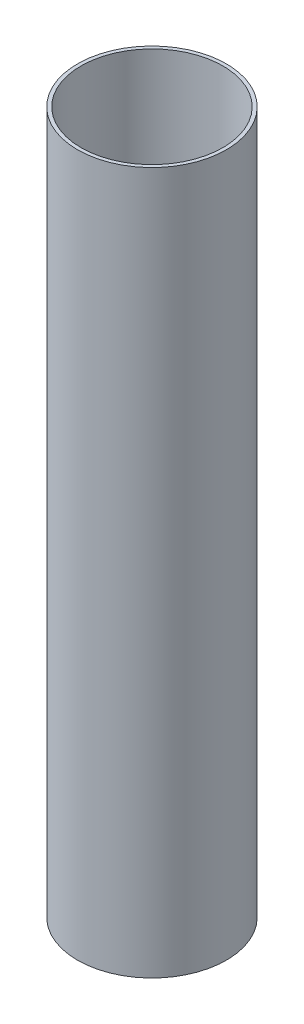
ISO-10303-21;
HEADER;
FILE_DESCRIPTION(('STEP AP214'),'2;1');
FILE_NAME('part.step','',(''),(''),'','','');
FILE_SCHEMA(('AUTOMOTIVE_DESIGN { 1 0 10303 214 1 1 1 1 }'));
ENDSEC;
DATA;
#1=APPLICATION_CONTEXT('core data for automotive mechanical design processes');
#2=APPLICATION_PROTOCOL_DEFINITION('international standard','automotive_design',2000,#1);
#3=PRODUCT_CONTEXT('',#1,'mechanical');
#4=PRODUCT('Part','Part','',(#3));
#5=PRODUCT_RELATED_PRODUCT_CATEGORY('part','',(#4));
#6=PRODUCT_DEFINITION_FORMATION('','',#4);
#7=PRODUCT_DEFINITION_CONTEXT('part definition',#1,'design');
#8=PRODUCT_DEFINITION('design','',#6,#7);
#9=PRODUCT_DEFINITION_SHAPE('','',#8);
#10=(LENGTH_UNIT() NAMED_UNIT(*) SI_UNIT(.MILLI.,.METRE.));
#11=(NAMED_UNIT(*) PLANE_ANGLE_UNIT() SI_UNIT($,.RADIAN.));
#12=(NAMED_UNIT(*) SI_UNIT($,.STERADIAN.) SOLID_ANGLE_UNIT());
#13=UNCERTAINTY_MEASURE_WITH_UNIT(LENGTH_MEASURE(1.E-05),#10,'distance_accuracy_value','');
#14=(GEOMETRIC_REPRESENTATION_CONTEXT(3) GLOBAL_UNCERTAINTY_ASSIGNED_CONTEXT((#13)) GLOBAL_UNIT_ASSIGNED_CONTEXT((#10,
#11,#12)) REPRESENTATION_CONTEXT('',''));
#15=CARTESIAN_POINT('',(0.,0.,0.));
#16=DIRECTION('',(0.,0.,1.));
#17=DIRECTION('',(1.,0.,0.));
#18=AXIS2_PLACEMENT_3D('',#15,#16,#17);
#19=CARTESIAN_POINT('',(0.,198.,0.));
#20=DIRECTION('',(0.,-1.,0.));
#21=DIRECTION('',(0.,0.,-1.));
#22=AXIS2_PLACEMENT_3D('',#19,#20,#21);
#23=CYLINDRICAL_SURFACE('',#22,21.);
#24=CARTESIAN_POINT('',(0.,198.,0.));
#25=DIRECTION('',(0.,1.,0.));
#26=DIRECTION('',(0.,0.,1.));
#27=AXIS2_PLACEMENT_3D('',#24,#25,#26);
#28=CIRCLE('',#27,21.);
#29=CARTESIAN_POINT('',(0.,198.,21.));
#30=VERTEX_POINT('',#29);
#31=EDGE_CURVE('E10',#30,#30,#28,.T.);
#32=ORIENTED_EDGE('',*,*,#31,.F.);
#33=EDGE_LOOP('',(#32));
#34=FACE_BOUND('',#33,.T.);
#35=CARTESIAN_POINT('',(0.,0.,0.));
#36=DIRECTION('',(0.,1.,0.));
#37=DIRECTION('',(0.,0.,1.));
#38=AXIS2_PLACEMENT_3D('',#35,#36,#37);
#39=CIRCLE('',#38,21.);
#40=CARTESIAN_POINT('',(0.,0.,21.));
#41=VERTEX_POINT('',#40);
#42=EDGE_CURVE('E52',#41,#41,#39,.T.);
#43=ORIENTED_EDGE('',*,*,#42,.T.);
#44=EDGE_LOOP('',(#43));
#45=FACE_BOUND('',#44,.T.);
#46=ADVANCED_FACE('F49',(#34,#45),#23,.T.);
#47=CARTESIAN_POINT('',(0.,198.,0.));
#48=DIRECTION('',(0.,1.,0.));
#49=DIRECTION('',(0.,0.,1.));
#50=AXIS2_PLACEMENT_3D('',#47,#48,#49);
#51=PLANE('',#50);
#52=CARTESIAN_POINT('',(0.,198.,0.));
#53=DIRECTION('',(0.,1.,0.));
#54=DIRECTION('',(0.,0.,1.));
#55=AXIS2_PLACEMENT_3D('',#52,#53,#54);
#56=CIRCLE('',#55,20.);
#57=CARTESIAN_POINT('',(0.,198.,20.));
#58=VERTEX_POINT('',#57);
#59=EDGE_CURVE('E63',#58,#58,#56,.T.);
#60=ORIENTED_EDGE('',*,*,#59,.F.);
#61=EDGE_LOOP('',(#60));
#62=FACE_BOUND('',#61,.T.);
#63=ORIENTED_EDGE('',*,*,#31,.T.);
#64=EDGE_LOOP('',(#63));
#65=FACE_BOUND('',#64,.T.);
#66=ADVANCED_FACE('F80',(#62,#65),#51,.T.);
#67=CARTESIAN_POINT('',(0.,0.,0.));
#68=DIRECTION('',(0.,1.,0.));
#69=DIRECTION('',(0.,0.,1.));
#70=AXIS2_PLACEMENT_3D('',#67,#68,#69);
#71=PLANE('',#70);
#72=CARTESIAN_POINT('',(0.,0.,0.));
#73=DIRECTION('',(0.,1.,0.));
#74=DIRECTION('',(0.,0.,1.));
#75=AXIS2_PLACEMENT_3D('',#72,#73,#74);
#76=CIRCLE('',#75,20.);
#77=CARTESIAN_POINT('',(0.,0.,20.));
#78=VERTEX_POINT('',#77);
#79=EDGE_CURVE('E61',#78,#78,#76,.T.);
#80=ORIENTED_EDGE('',*,*,#79,.T.);
#81=EDGE_LOOP('',(#80));
#82=FACE_BOUND('',#81,.T.);
#83=ORIENTED_EDGE('',*,*,#42,.F.);
#84=EDGE_LOOP('',(#83));
#85=FACE_BOUND('',#84,.T.);
#86=ADVANCED_FACE('F71',(#82,#85),#71,.F.);
#87=CARTESIAN_POINT('',(0.,0.,0.));
#88=DIRECTION('',(0.,1.,0.));
#89=DIRECTION('',(0.,0.,1.));
#90=AXIS2_PLACEMENT_3D('',#87,#88,#89);
#91=CYLINDRICAL_SURFACE('',#90,20.);
#92=ORIENTED_EDGE('',*,*,#79,.F.);
#93=EDGE_LOOP('',(#92));
#94=FACE_BOUND('',#93,.T.);
#95=ORIENTED_EDGE('',*,*,#59,.T.);
#96=EDGE_LOOP('',(#95));
#97=FACE_BOUND('',#96,.T.);
#98=ADVANCED_FACE('F74',(#94,#97),#91,.F.);
#99=CLOSED_SHELL('',(#46,#66,#86,#98));
#100=MANIFOLD_SOLID_BREP('B2',#99);
#101=ADVANCED_BREP_SHAPE_REPRESENTATION('',(#18,#100),#14);
#102=SHAPE_DEFINITION_REPRESENTATION(#9,#101);
ENDSEC;
END-ISO-10303-21;
